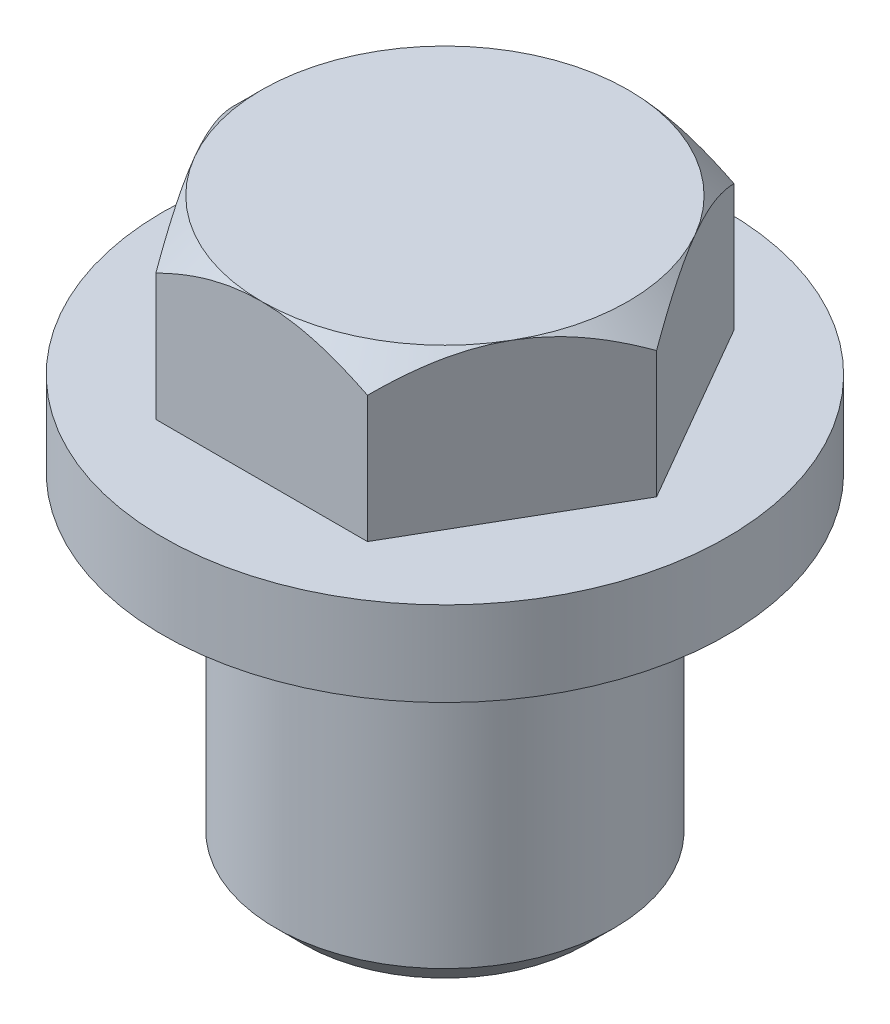
ISO-10303-21;
HEADER;
FILE_DESCRIPTION(('STEP AP214'),'2;1');
FILE_NAME('part.step','',(''),(''),'','','');
FILE_SCHEMA(('AUTOMOTIVE_DESIGN { 1 0 10303 214 1 1 1 1 }'));
ENDSEC;
DATA;
#1=APPLICATION_CONTEXT('core data for automotive mechanical design processes');
#2=APPLICATION_PROTOCOL_DEFINITION('international standard','automotive_design',2000,#1);
#3=PRODUCT_CONTEXT('',#1,'mechanical');
#4=PRODUCT('Part','Part','',(#3));
#5=PRODUCT_RELATED_PRODUCT_CATEGORY('part','',(#4));
#6=PRODUCT_DEFINITION_FORMATION('','',#4);
#7=PRODUCT_DEFINITION_CONTEXT('part definition',#1,'design');
#8=PRODUCT_DEFINITION('design','',#6,#7);
#9=PRODUCT_DEFINITION_SHAPE('','',#8);
#10=(LENGTH_UNIT() NAMED_UNIT(*) SI_UNIT(.MILLI.,.METRE.));
#11=(NAMED_UNIT(*) PLANE_ANGLE_UNIT() SI_UNIT($,.RADIAN.));
#12=(NAMED_UNIT(*) SI_UNIT($,.STERADIAN.) SOLID_ANGLE_UNIT());
#13=UNCERTAINTY_MEASURE_WITH_UNIT(LENGTH_MEASURE(1.E-05),#10,'distance_accuracy_value','');
#14=(GEOMETRIC_REPRESENTATION_CONTEXT(3) GLOBAL_UNCERTAINTY_ASSIGNED_CONTEXT((#13)) GLOBAL_UNIT_ASSIGNED_CONTEXT((#10,
#11,#12)) REPRESENTATION_CONTEXT('',''));
#15=CARTESIAN_POINT('',(0.,0.,0.));
#16=DIRECTION('',(0.,0.,1.));
#17=DIRECTION('',(1.,0.,0.));
#18=AXIS2_PLACEMENT_3D('',#15,#16,#17);
#19=CARTESIAN_POINT('',(3.75277674973257,20.5,-6.5));
#20=DIRECTION('',(0.,0.,1.));
#21=DIRECTION('',(1.,0.,0.));
#22=AXIS2_PLACEMENT_3D('',#19,#20,#21);
#23=PLANE('',#22);
#24=CARTESIAN_POINT('',(13.0579933178711,12.4136642884662,-6.5));
#25=CARTESIAN_POINT('',(12.8676478667876,12.5840618464185,-6.5));
#26=CARTESIAN_POINT('',(12.6769387361621,12.7540531278729,-6.5));
#27=CARTESIAN_POINT('',(12.294693048205,13.0931069803304,-6.5));
#28=CARTESIAN_POINT('',(12.1031564816364,13.2621695409177,-6.5));
#29=CARTESIAN_POINT('',(11.5270349767058,13.7678956282045,-6.5));
#30=CARTESIAN_POINT('',(11.1410639604891,14.1029847366094,-6.5));
#31=CARTESIAN_POINT('',(10.3600902933382,14.7713385939418,-6.5));
#32=CARTESIAN_POINT('',(9.96503495350513,15.1045419396543,-6.5));
#33=CARTESIAN_POINT('',(9.16866881116364,15.7632592959962,-6.5));
#34=CARTESIAN_POINT('',(8.7673591928568,16.0887747336064,-6.5));
#35=CARTESIAN_POINT('',(7.98479662049519,16.7066397978193,-6.5));
#36=CARTESIAN_POINT('',(7.60411840138144,16.9997117654242,-6.5));
#37=CARTESIAN_POINT('',(7.02566999292735,17.429549771014,-6.5));
#38=CARTESIAN_POINT('',(6.83155942765734,17.5712394475604,-6.5));
#39=CARTESIAN_POINT('',(6.44048143614298,17.8506263971717,-6.5));
#40=CARTESIAN_POINT('',(6.24351404813838,17.9883237236021,-6.5));
#41=CARTESIAN_POINT('',(5.84671937761408,18.258542914534,-6.5));
#42=CARTESIAN_POINT('',(5.64689979552351,18.3910760513554,-6.5));
#43=CARTESIAN_POINT('',(5.24340072137308,18.6501903477576,-6.5));
#44=CARTESIAN_POINT('',(5.03972094283108,18.7767710631369,-6.5));
#45=CARTESIAN_POINT('',(4.62810130284319,19.0224021998703,-6.5));
#46=CARTESIAN_POINT('',(4.42016553239671,19.1414594409,-6.5));
#47=CARTESIAN_POINT('',(3.99925370912746,19.3702669186559,-6.5));
#48=CARTESIAN_POINT('',(3.78627875004098,19.4800191517216,-6.5));
#49=CARTESIAN_POINT('',(3.36967244546428,19.6805919761908,-6.5));
#50=CARTESIAN_POINT('',(3.16642228969666,19.7721985201492,-6.5));
#51=CARTESIAN_POINT('',(2.75466543476402,19.9428695641421,-6.5));
#52=CARTESIAN_POINT('',(2.54615870469405,20.021933990418,-6.5));
#53=CARTESIAN_POINT('',(2.12479683004322,20.1643834967131,-6.5));
#54=CARTESIAN_POINT('',(1.9119645011036,20.2278351752403,-6.5));
#55=CARTESIAN_POINT('',(1.48171265610126,20.336501662942,-6.5));
#56=CARTESIAN_POINT('',(1.26429505170368,20.3817239200107,-6.5));
#57=CARTESIAN_POINT('',(0.822334836726203,20.4518789704477,-6.5));
#58=CARTESIAN_POINT('',(0.597733953232176,20.4764523387116,-6.5));
#59=CARTESIAN_POINT('',(0.14719969963484,20.5022218402525,-6.5));
#60=CARTESIAN_POINT('',(-0.0787334743936866,20.5034213316368,-6.5));
#61=CARTESIAN_POINT('',(-0.529843655003775,20.4823416206549,-6.5));
#62=CARTESIAN_POINT('',(-0.755018868705866,20.4600247759557,-6.5));
#63=CARTESIAN_POINT('',(-1.20209837429994,20.3934810962455,-6.5));
#64=CARTESIAN_POINT('',(-1.42400168551428,20.3492478244356,-6.5));
#65=CARTESIAN_POINT('',(-1.91821447954304,20.2281019470089,-6.5));
#66=CARTESIAN_POINT('',(-2.18918356387655,20.1457714741221,-6.5));
#67=CARTESIAN_POINT('',(-2.72262103439964,19.9572567613044,-6.5));
#68=CARTESIAN_POINT('',(-2.98508521594335,19.8510609226492,-6.5));
#69=CARTESIAN_POINT('',(-3.50474538482197,19.6190425400518,-6.5));
#70=CARTESIAN_POINT('',(-3.76184496840596,19.4930066530396,-6.5));
#71=CARTESIAN_POINT('',(-4.14177246811261,19.2933328668315,-6.5));
#72=CARTESIAN_POINT('',(-4.26744936641737,19.2250121128777,-6.5));
#73=CARTESIAN_POINT('',(-4.51706186165945,19.0852575670984,-6.5));
#74=CARTESIAN_POINT('',(-4.64099747502046,19.0138238046608,-6.5));
#75=CARTESIAN_POINT('',(-4.96095487323614,18.8246806872913,-6.5));
#76=CARTESIAN_POINT('',(-5.15572892675147,18.7048617303674,-6.5));
#77=CARTESIAN_POINT('',(-5.54171578730951,18.4596007548328,-6.5));
#78=CARTESIAN_POINT('',(-5.73292818023867,18.3341580880602,-6.5));
#79=CARTESIAN_POINT('',(-6.11232862707531,18.078627555365,-6.5));
#80=CARTESIAN_POINT('',(-6.30051541961305,17.9485378213551,-6.5));
#81=CARTESIAN_POINT('',(-6.67420504220551,17.684552502132,-6.5));
#82=CARTESIAN_POINT('',(-6.85970774778673,17.5506567412638,-6.5));
#83=CARTESIAN_POINT('',(-7.4136436126358,17.1435794055568,-6.5));
#84=CARTESIAN_POINT('',(-7.77858010243288,16.8656395741159,-6.5));
#85=CARTESIAN_POINT('',(-8.50131056399441,16.3008575994114,-6.5));
#86=CARTESIAN_POINT('',(-8.85910610936269,16.0140174538533,-6.5));
#87=CARTESIAN_POINT('',(-9.54248723672809,15.4555943786326,-6.5));
#88=CARTESIAN_POINT('',(-9.86846685398065,15.1844923934395,-6.5));
#89=CARTESIAN_POINT('',(-10.5167496028818,14.637892960225,-6.5));
#90=CARTESIAN_POINT('',(-10.8390524832036,14.3623952147785,-6.5));
#91=CARTESIAN_POINT('',(-11.4788440771141,13.8095482031692,-6.5));
#92=CARTESIAN_POINT('',(-11.7963497890914,13.532218570862,-6.5));
#93=CARTESIAN_POINT('',(-12.4288878968457,12.9748343192829,-6.5));
#94=CARTESIAN_POINT('',(-12.7439206114731,12.6947800620886,-6.5));
#95=CARTESIAN_POINT('',(-13.0579933178711,12.4136642884662,-6.5));
#96=B_SPLINE_CURVE_WITH_KNOTS('',3,(#24,#25,#26,#27,#28,#29,#30,#31,#32,#33,#34,#35,#36,#37,#38,
#39,#40,#41,#42,#43,#44,#45,#46,#47,#48,#49,#50,#51,#52,#53,#54,#55,#56,#57,#58,#59,#60,#61,#62,
#63,#64,#65,#66,#67,#68,#69,#70,#71,#72,#73,#74,#75,#76,#77,#78,#79,#80,#81,#82,#83,#84,#85,#86,
#87,#88,#89,#90,#91,#92,#93,#94,#95),.UNSPECIFIED.,.F.,.F.,(4,2,2,2,2,2,2,2,2,2,2,2,2,2,2,2,2,2,
2,2,2,2,2,2,2,2,2,2,2,2,2,2,2,2,2,4),(0.,0.766419534611869,1.53284764733988,3.06621063208658,
4.61657183546322,6.16664297229325,7.60768402827945,8.32861220564402,9.04953074198019,
9.76877573175528,10.4880743105206,11.2067112387935,11.925193595157,12.593675934138,
13.2621622042391,13.9277454884945,14.5930565627731,15.2697216593766,15.9462895392979,
16.6239420412191,17.301793686039,18.149921778442,18.9984629615211,19.8568453930995,
20.2859530738716,20.7150567046053,21.4009636063593,22.0869497667359,22.7732148623685,
23.4595116819316,24.8354623796852,26.2111064434346,27.4829971557616,28.7549742945708,
30.0196682745985,31.2841964237747),.UNSPECIFIED.);
#97=CARTESIAN_POINT('',(3.75277674973257,19.4944465005349,-6.5));
#98=VERTEX_POINT('',#97);
#99=CARTESIAN_POINT('',(0.,20.5,-6.5));
#100=VERTEX_POINT('',#99);
#101=EDGE_CURVE('E273',#98,#100,#96,.T.);
#102=ORIENTED_EDGE('',*,*,#101,.F.);
#103=DIRECTION('',(0.,-1.,0.));
#104=VECTOR('',#103,1.);
#105=CARTESIAN_POINT('',(3.75277674973257,20.5,-6.5));
#106=LINE('',#105,#104);
#107=CARTESIAN_POINT('',(3.75277674973257,15.,-6.5));
#108=VERTEX_POINT('',#107);
#109=EDGE_CURVE('E256',#98,#108,#106,.T.);
#110=ORIENTED_EDGE('',*,*,#109,.T.);
#111=DIRECTION('',(-1.,0.,0.));
#112=VECTOR('',#111,1.);
#113=CARTESIAN_POINT('',(3.75277674973257,15.,-6.5));
#114=LINE('',#113,#112);
#115=CARTESIAN_POINT('',(-3.75277674973257,15.,-6.5));
#116=VERTEX_POINT('',#115);
#117=EDGE_CURVE('E271',#108,#116,#114,.T.);
#118=ORIENTED_EDGE('',*,*,#117,.T.);
#119=DIRECTION('',(0.,-1.,0.));
#120=VECTOR('',#119,1.);
#121=CARTESIAN_POINT('',(-3.75277674973257,20.5,-6.5));
#122=LINE('',#121,#120);
#123=CARTESIAN_POINT('',(-3.75277674973257,19.4944465005349,-6.5));
#124=VERTEX_POINT('',#123);
#125=EDGE_CURVE('E247',#124,#116,#122,.T.);
#126=ORIENTED_EDGE('',*,*,#125,.F.);
#127=EDGE_CURVE('E179',#100,#124,#96,.T.);
#128=ORIENTED_EDGE('',*,*,#127,.F.);
#129=EDGE_LOOP('',(#102,#110,#118,#126,#128));
#130=FACE_BOUND('',#129,.T.);
#131=ADVANCED_FACE('F38',(#130),#23,.F.);
#132=CARTESIAN_POINT('',(-3.75277674973257,20.5,-6.5));
#133=DIRECTION('',(0.866025403784439,0.,0.5));
#134=DIRECTION('',(0.5,0.,-0.866025403784439));
#135=AXIS2_PLACEMENT_3D('',#132,#133,#134);
#136=PLANE('',#135);
#137=CARTESIAN_POINT('',(-3.75266127967873,19.4943310278164,-6.5002));
#138=CARTESIAN_POINT('',(-3.81718755645788,19.5588505971256,-6.38843721019527));
#139=CARTESIAN_POINT('',(-3.88220981195734,19.6213901510945,-6.27581536004748));
#140=CARTESIAN_POINT('',(-4.0133435827194,19.7419069190787,-6.0486850064995));
#141=CARTESIAN_POINT('',(-4.0794556693862,19.7998816413584,-5.9341755133982));
#142=CARTESIAN_POINT('',(-4.28018681300944,19.9665494716349,-5.58649897398135));
#143=CARTESIAN_POINT('',(-4.41650514865447,20.0672752428145,-5.35038869064092));
#144=CARTESIAN_POINT('',(-4.69140196688396,20.2397611517808,-4.87425343462842));
#145=CARTESIAN_POINT('',(-4.82991018943444,20.3119558356256,-4.63435015590494));
#146=CARTESIAN_POINT('',(-5.0399496233385,20.3954673235371,-4.27055118479009));
#147=CARTESIAN_POINT('',(-5.11027200006593,20.419163228593,-4.14874925538919));
#148=CARTESIAN_POINT('',(-5.25151217356569,20.4577586469965,-3.90411409881775));
#149=CARTESIAN_POINT('',(-5.3224298797485,20.4726594749108,-3.78128102855289));
#150=CARTESIAN_POINT('',(-5.49524688598533,20.4976428826817,-3.48195319333875));
#151=CARTESIAN_POINT('',(-5.59733238973658,20.5028848373424,-3.30513591412532));
#152=CARTESIAN_POINT('',(-5.80131940012282,20.4940862649858,-2.95182004805227));
#153=CARTESIAN_POINT('',(-5.90322082972474,20.4800389787509,-2.77532159461784));
#154=CARTESIAN_POINT('',(-6.10606297517406,20.4334899588109,-2.42398869278334));
#155=CARTESIAN_POINT('',(-6.20700248809816,20.4009675877114,-2.24915632790756));
#156=CARTESIAN_POINT('',(-6.40714660889902,20.3192365179224,-1.90249654184425));
#157=CARTESIAN_POINT('',(-6.50635134919487,20.2700290987382,-1.73066889130016));
#158=CARTESIAN_POINT('',(-6.68245686028528,20.168794739105,-1.42564519859869));
#159=CARTESIAN_POINT('',(-6.7597475954527,20.119430314376,-1.29177371833437));
#160=CARTESIAN_POINT('',(-6.91294161848703,20.0127466105512,-1.02643388702304));
#161=CARTESIAN_POINT('',(-6.98884486421244,19.9554270902921,-0.89496560896725));
#162=CARTESIAN_POINT('',(-7.13902483818045,19.8341180729928,-0.63484626377528));
#163=CARTESIAN_POINT('',(-7.21330583760992,19.7701495516337,-0.506187798726436));
#164=CARTESIAN_POINT('',(-7.36049237141899,19.6363823521427,-0.251253243979178));
#165=CARTESIAN_POINT('',(-7.43339871615508,19.5665872494398,-0.124975750702145));
#166=CARTESIAN_POINT('',(-7.50566896951897,19.4943310278164,0.000199999999997961));
#167=B_SPLINE_CURVE_WITH_KNOTS('',3,(#137,#138,#139,#140,#141,#142,#143,#144,#145,#146,#147,
#148,#149,#150,#151,#152,#153,#154,#155,#156,#157,#158,#159,#160,#161,#162,#163,#164,#165,#166),
.UNSPECIFIED.,.F.,.F.,(4,2,2,2,2,2,2,2,2,2,2,2,2,2,4),(0.,0.432821098198452,0.865876839223425,
1.73666364694241,2.59362329760357,3.02126269407585,3.44883815671482,4.06060100939777,
4.67257828698748,5.28524051521266,5.89785577160171,6.38444407043269,6.87104712368551,
7.35615917312025,7.84097569580793),.UNSPECIFIED.);
#168=CARTESIAN_POINT('',(-5.62916512459885,20.5,-3.25));
#169=VERTEX_POINT('',#168);
#170=EDGE_CURVE('E177',#124,#169,#167,.T.);
#171=ORIENTED_EDGE('',*,*,#170,.F.);
#172=ORIENTED_EDGE('',*,*,#125,.T.);
#173=DIRECTION('',(-0.5,0.,0.866025403784439));
#174=VECTOR('',#173,1.);
#175=CARTESIAN_POINT('',(-3.75277674973257,15.,-6.5));
#176=LINE('',#175,#174);
#177=CARTESIAN_POINT('',(-7.50555349946513,15.,0.));
#178=VERTEX_POINT('',#177);
#179=EDGE_CURVE('E269',#116,#178,#176,.T.);
#180=ORIENTED_EDGE('',*,*,#179,.T.);
#181=DIRECTION('',(0.,-1.,0.));
#182=VECTOR('',#181,1.);
#183=CARTESIAN_POINT('',(-7.50555349946513,20.5,0.));
#184=LINE('',#183,#182);
#185=CARTESIAN_POINT('',(-7.50555349946513,19.4944465005349,0.));
#186=VERTEX_POINT('',#185);
#187=EDGE_CURVE('E249',#186,#178,#184,.T.);
#188=ORIENTED_EDGE('',*,*,#187,.F.);
#189=EDGE_CURVE('E171',#169,#186,#167,.T.);
#190=ORIENTED_EDGE('',*,*,#189,.F.);
#191=EDGE_LOOP('',(#171,#172,#180,#188,#190));
#192=FACE_BOUND('',#191,.T.);
#193=ADVANCED_FACE('F186',(#192),#136,.F.);
#194=CARTESIAN_POINT('',(-7.50555349946513,20.5,0.));
#195=DIRECTION('',(0.866025403784439,0.,-0.5));
#196=DIRECTION('',(-0.5,0.,-0.866025403784439));
#197=AXIS2_PLACEMENT_3D('',#194,#195,#196);
#198=PLANE('',#197);
#199=CARTESIAN_POINT('',(-7.50566896951897,19.4943310278164,-0.000200000000001231));
#200=CARTESIAN_POINT('',(-7.44114269273983,19.5588505971256,0.111562789804731));
#201=CARTESIAN_POINT('',(-7.37612043724037,19.6213901510945,0.224184639952521));
#202=CARTESIAN_POINT('',(-7.24498666647831,19.7419069190787,0.451314993500498));
#203=CARTESIAN_POINT('',(-7.1788745798115,19.7998816413584,0.565824486601802));
#204=CARTESIAN_POINT('',(-6.97814343618827,19.9665494716349,0.913501026018651));
#205=CARTESIAN_POINT('',(-6.84182510054323,20.0672752428145,1.14961130935908));
#206=CARTESIAN_POINT('',(-6.56692828231374,20.2397611517808,1.62574656537158));
#207=CARTESIAN_POINT('',(-6.42842005976327,20.3119558356256,1.86564984409506));
#208=CARTESIAN_POINT('',(-6.2183806258592,20.3954673235371,2.22944881520991));
#209=CARTESIAN_POINT('',(-6.14805824913177,20.419163228593,2.35125074461081));
#210=CARTESIAN_POINT('',(-6.00681807563201,20.4577586469965,2.59588590118225));
#211=CARTESIAN_POINT('',(-5.9359003694492,20.4726594749108,2.71871897144711));
#212=CARTESIAN_POINT('',(-5.76308336321237,20.4976428826817,3.01804680666125));
#213=CARTESIAN_POINT('',(-5.66099785946112,20.5028848373424,3.19486408587468));
#214=CARTESIAN_POINT('',(-5.45701084907488,20.4940862649858,3.54817995194773));
#215=CARTESIAN_POINT('',(-5.35510941947296,20.4800389787509,3.72467840538216));
#216=CARTESIAN_POINT('',(-5.15226727402364,20.4334899588109,4.07601130721665));
#217=CARTESIAN_POINT('',(-5.05132776109955,20.4009675877114,4.25084367209244));
#218=CARTESIAN_POINT('',(-4.85118364029868,20.3192365179224,4.59750345815575));
#219=CARTESIAN_POINT('',(-4.75197890000283,20.2700290987382,4.76933110869983));
#220=CARTESIAN_POINT('',(-4.57587338891242,20.168794739105,5.0743548014013));
#221=CARTESIAN_POINT('',(-4.498582653745,20.119430314376,5.20822628166563));
#222=CARTESIAN_POINT('',(-4.34538863071067,20.0127466105512,5.47356611297696));
#223=CARTESIAN_POINT('',(-4.26948538498527,19.9554270902921,5.60503439103275));
#224=CARTESIAN_POINT('',(-4.11930541101726,19.8341180729928,5.86515373622472));
#225=CARTESIAN_POINT('',(-4.04502441158778,19.7701495516337,5.99381220127356));
#226=CARTESIAN_POINT('',(-3.89783787777871,19.6363823521427,6.24874675602082));
#227=CARTESIAN_POINT('',(-3.82493153304263,19.5665872494398,6.37502424929786));
#228=CARTESIAN_POINT('',(-3.75266127967873,19.4943310278164,6.5002));
#229=B_SPLINE_CURVE_WITH_KNOTS('',3,(#199,#200,#201,#202,#203,#204,#205,#206,#207,#208,#209,
#210,#211,#212,#213,#214,#215,#216,#217,#218,#219,#220,#221,#222,#223,#224,#225,#226,#227,#228),
.UNSPECIFIED.,.F.,.F.,(4,2,2,2,2,2,2,2,2,2,2,2,2,2,4),(0.,0.432821098198451,0.865876839223428,
1.73666364694241,2.59362329760357,3.02126269407586,3.44883815671483,4.06060100939777,
4.67257828698748,5.28524051521266,5.89785577160171,6.3844440704327,6.87104712368551,
7.35615917312025,7.84097569580794),.UNSPECIFIED.);
#230=CARTESIAN_POINT('',(-5.62916512459885,20.5,3.25));
#231=VERTEX_POINT('',#230);
#232=EDGE_CURVE('E178',#186,#231,#229,.T.);
#233=ORIENTED_EDGE('',*,*,#232,.F.);
#234=ORIENTED_EDGE('',*,*,#187,.T.);
#235=DIRECTION('',(0.5,0.,0.866025403784439));
#236=VECTOR('',#235,1.);
#237=CARTESIAN_POINT('',(-7.50555349946513,15.,0.));
#238=LINE('',#237,#236);
#239=CARTESIAN_POINT('',(-3.75277674973257,15.,6.5));
#240=VERTEX_POINT('',#239);
#241=EDGE_CURVE('E266',#178,#240,#238,.T.);
#242=ORIENTED_EDGE('',*,*,#241,.T.);
#243=DIRECTION('',(0.,-1.,0.));
#244=VECTOR('',#243,1.);
#245=CARTESIAN_POINT('',(-3.75277674973257,20.5,6.5));
#246=LINE('',#245,#244);
#247=CARTESIAN_POINT('',(-3.75277674973257,19.4944465005349,6.5));
#248=VERTEX_POINT('',#247);
#249=EDGE_CURVE('E251',#248,#240,#246,.T.);
#250=ORIENTED_EDGE('',*,*,#249,.F.);
#251=EDGE_CURVE('E164',#231,#248,#229,.T.);
#252=ORIENTED_EDGE('',*,*,#251,.F.);
#253=EDGE_LOOP('',(#233,#234,#242,#250,#252));
#254=FACE_BOUND('',#253,.T.);
#255=ADVANCED_FACE('F189',(#254),#198,.F.);
#256=CARTESIAN_POINT('',(-3.75277674973257,20.5,6.5));
#257=DIRECTION('',(0.,0.,-1.));
#258=DIRECTION('',(-1.,0.,0.));
#259=AXIS2_PLACEMENT_3D('',#256,#257,#258);
#260=PLANE('',#259);
#261=CARTESIAN_POINT('',(-13.0579933178711,12.4136642884662,6.5));
#262=CARTESIAN_POINT('',(-12.8676478667876,12.5840618464185,6.5));
#263=CARTESIAN_POINT('',(-12.6769387361621,12.7540531278729,6.5));
#264=CARTESIAN_POINT('',(-12.294693048205,13.0931069803304,6.5));
#265=CARTESIAN_POINT('',(-12.1031564816364,13.2621695409177,6.5));
#266=CARTESIAN_POINT('',(-11.5270349767058,13.7678956282045,6.5));
#267=CARTESIAN_POINT('',(-11.1410639604891,14.1029847366094,6.5));
#268=CARTESIAN_POINT('',(-10.3600902933382,14.7713385939419,6.5));
#269=CARTESIAN_POINT('',(-9.96503495350512,15.1045419396543,6.5));
#270=CARTESIAN_POINT('',(-9.16866881116363,15.7632592959962,6.5));
#271=CARTESIAN_POINT('',(-8.7673591928568,16.0887747336064,6.5));
#272=CARTESIAN_POINT('',(-7.98479662049518,16.7066397978193,6.5));
#273=CARTESIAN_POINT('',(-7.60411840138143,16.9997117654242,6.5));
#274=CARTESIAN_POINT('',(-7.02566999292734,17.429549771014,6.5));
#275=CARTESIAN_POINT('',(-6.83155942765734,17.5712394475604,6.5));
#276=CARTESIAN_POINT('',(-6.44048143614298,17.8506263971717,6.5));
#277=CARTESIAN_POINT('',(-6.24351404813837,17.9883237236021,6.5));
#278=CARTESIAN_POINT('',(-5.84671937761408,18.258542914534,6.5));
#279=CARTESIAN_POINT('',(-5.64689979552351,18.3910760513554,6.5));
#280=CARTESIAN_POINT('',(-5.24340072137308,18.6501903477576,6.5));
#281=CARTESIAN_POINT('',(-5.03972094283108,18.7767710631369,6.5));
#282=CARTESIAN_POINT('',(-4.62810130284319,19.0224021998703,6.5));
#283=CARTESIAN_POINT('',(-4.42016553239671,19.1414594409,6.5));
#284=CARTESIAN_POINT('',(-3.99925370912746,19.3702669186559,6.5));
#285=CARTESIAN_POINT('',(-3.78627875004098,19.4800191517216,6.5));
#286=CARTESIAN_POINT('',(-3.36967244546428,19.6805919761908,6.5));
#287=CARTESIAN_POINT('',(-3.16642228969666,19.7721985201492,6.5));
#288=CARTESIAN_POINT('',(-2.75466543476402,19.9428695641421,6.5));
#289=CARTESIAN_POINT('',(-2.54615870469405,20.021933990418,6.5));
#290=CARTESIAN_POINT('',(-2.12479683004322,20.1643834967131,6.5));
#291=CARTESIAN_POINT('',(-1.9119645011036,20.2278351752403,6.5));
#292=CARTESIAN_POINT('',(-1.48171265610126,20.336501662942,6.5));
#293=CARTESIAN_POINT('',(-1.26429505170368,20.3817239200107,6.5));
#294=CARTESIAN_POINT('',(-0.822334836726206,20.4518789704477,6.5));
#295=CARTESIAN_POINT('',(-0.597733953232178,20.4764523387116,6.5));
#296=CARTESIAN_POINT('',(-0.147199699634842,20.5022218402525,6.5));
#297=CARTESIAN_POINT('',(0.0787334743936834,20.5034213316368,6.5));
#298=CARTESIAN_POINT('',(0.529843655003772,20.4823416206549,6.5));
#299=CARTESIAN_POINT('',(0.755018868705863,20.4600247759557,6.5));
#300=CARTESIAN_POINT('',(1.20209837429994,20.3934810962456,6.5));
#301=CARTESIAN_POINT('',(1.42400168551428,20.3492478244356,6.5));
#302=CARTESIAN_POINT('',(1.91821447954304,20.2281019470089,6.5));
#303=CARTESIAN_POINT('',(2.18918356387654,20.1457714741221,6.5));
#304=CARTESIAN_POINT('',(2.72262103439964,19.9572567613044,6.5));
#305=CARTESIAN_POINT('',(2.98508521594335,19.8510609226492,6.5));
#306=CARTESIAN_POINT('',(3.50474538482197,19.6190425400518,6.5));
#307=CARTESIAN_POINT('',(3.76184496840596,19.4930066530396,6.5));
#308=CARTESIAN_POINT('',(4.1417724681126,19.2933328668315,6.5));
#309=CARTESIAN_POINT('',(4.26744936641736,19.2250121128777,6.5));
#310=CARTESIAN_POINT('',(4.51706186165944,19.0852575670984,6.5));
#311=CARTESIAN_POINT('',(4.64099747502045,19.0138238046608,6.5));
#312=CARTESIAN_POINT('',(4.96095487323613,18.8246806872913,6.5));
#313=CARTESIAN_POINT('',(5.15572892675146,18.7048617303674,6.5));
#314=CARTESIAN_POINT('',(5.5417157873095,18.4596007548328,6.5));
#315=CARTESIAN_POINT('',(5.73292818023866,18.3341580880602,6.5));
#316=CARTESIAN_POINT('',(6.1123286270753,18.078627555365,6.5));
#317=CARTESIAN_POINT('',(6.30051541961304,17.9485378213552,6.5));
#318=CARTESIAN_POINT('',(6.6742050422055,17.684552502132,6.5));
#319=CARTESIAN_POINT('',(6.85970774778672,17.5506567412638,6.5));
#320=CARTESIAN_POINT('',(7.41364361263579,17.1435794055568,6.5));
#321=CARTESIAN_POINT('',(7.77858010243287,16.865639574116,6.5));
#322=CARTESIAN_POINT('',(8.5013105639944,16.3008575994114,6.5));
#323=CARTESIAN_POINT('',(8.85910610936268,16.0140174538533,6.5));
#324=CARTESIAN_POINT('',(9.54248723672808,15.4555943786327,6.5));
#325=CARTESIAN_POINT('',(9.86846685398064,15.1844923934395,6.5));
#326=CARTESIAN_POINT('',(10.5167496028818,14.637892960225,6.5));
#327=CARTESIAN_POINT('',(10.8390524832036,14.3623952147785,6.5));
#328=CARTESIAN_POINT('',(11.4788440771141,13.8095482031692,6.5));
#329=CARTESIAN_POINT('',(11.7963497890914,13.532218570862,6.5));
#330=CARTESIAN_POINT('',(12.4288878968457,12.974834319283,6.5));
#331=CARTESIAN_POINT('',(12.7439206114731,12.6947800620886,6.5));
#332=CARTESIAN_POINT('',(13.0579933178711,12.4136642884662,6.5));
#333=B_SPLINE_CURVE_WITH_KNOTS('',3,(#261,#262,#263,#264,#265,#266,#267,#268,#269,#270,#271,
#272,#273,#274,#275,#276,#277,#278,#279,#280,#281,#282,#283,#284,#285,#286,#287,#288,#289,#290,
#291,#292,#293,#294,#295,#296,#297,#298,#299,#300,#301,#302,#303,#304,#305,#306,#307,#308,#309,
#310,#311,#312,#313,#314,#315,#316,#317,#318,#319,#320,#321,#322,#323,#324,#325,#326,#327,#328,
#329,#330,#331,#332),.UNSPECIFIED.,.F.,.F.,(4,2,2,2,2,2,2,2,2,2,2,2,2,2,2,2,2,2,2,2,2,2,2,2,2,2,
2,2,2,2,2,2,2,2,2,4),(0.,0.766419534611871,1.53284764733988,3.06621063208658,4.61657183546322,
6.16664297229325,7.60768402827945,8.32861220564402,9.04953074198019,9.76877573175527,
10.4880743105206,11.2067112387935,11.925193595157,12.593675934138,13.2621622042391,
13.9277454884945,14.5930565627731,15.2697216593766,15.9462895392979,16.6239420412191,
17.3017936860389,18.149921778442,18.9984629615211,19.8568453930994,20.2859530738716,
20.7150567046053,21.4009636063592,22.0869497667359,22.7732148623685,23.4595116819315,
24.8354623796852,26.2111064434346,27.4829971557616,28.7549742945707,30.0196682745985,
31.2841964237747),.UNSPECIFIED.);
#334=CARTESIAN_POINT('',(0.,20.5,6.5));
#335=VERTEX_POINT('',#334);
#336=EDGE_CURVE('E300',#248,#335,#333,.T.);
#337=ORIENTED_EDGE('',*,*,#336,.F.);
#338=ORIENTED_EDGE('',*,*,#249,.T.);
#339=DIRECTION('',(1.,0.,0.));
#340=VECTOR('',#339,1.);
#341=CARTESIAN_POINT('',(-3.75277674973257,15.,6.5));
#342=LINE('',#341,#340);
#343=CARTESIAN_POINT('',(3.75277674973257,15.,6.5));
#344=VERTEX_POINT('',#343);
#345=EDGE_CURVE('E263',#240,#344,#342,.T.);
#346=ORIENTED_EDGE('',*,*,#345,.T.);
#347=DIRECTION('',(0.,-1.,0.));
#348=VECTOR('',#347,1.);
#349=CARTESIAN_POINT('',(3.75277674973257,20.5,6.5));
#350=LINE('',#349,#348);
#351=CARTESIAN_POINT('',(3.75277674973257,19.4944465005349,6.5));
#352=VERTEX_POINT('',#351);
#353=EDGE_CURVE('E253',#352,#344,#350,.T.);
#354=ORIENTED_EDGE('',*,*,#353,.F.);
#355=EDGE_CURVE('E110',#335,#352,#333,.T.);
#356=ORIENTED_EDGE('',*,*,#355,.F.);
#357=EDGE_LOOP('',(#337,#338,#346,#354,#356));
#358=FACE_BOUND('',#357,.T.);
#359=ADVANCED_FACE('F299',(#358),#260,.F.);
#360=CARTESIAN_POINT('',(3.75277674973257,20.5,6.5));
#361=DIRECTION('',(-0.866025403784438,0.,-0.5));
#362=DIRECTION('',(-0.5,0.,0.866025403784439));
#363=AXIS2_PLACEMENT_3D('',#360,#361,#362);
#364=PLANE('',#363);
#365=CARTESIAN_POINT('',(3.75266127967873,19.4943310278164,6.5002));
#366=CARTESIAN_POINT('',(3.81718755645788,19.5588505971256,6.38843721019526));
#367=CARTESIAN_POINT('',(3.88220981195734,19.6213901510945,6.27581536004747));
#368=CARTESIAN_POINT('',(4.01334358271939,19.7419069190787,6.0486850064995));
#369=CARTESIAN_POINT('',(4.0794556693862,19.7998816413584,5.93417551339819));
#370=CARTESIAN_POINT('',(4.28018681300943,19.9665494716349,5.58649897398135));
#371=CARTESIAN_POINT('',(4.41650514865447,20.0672752428145,5.35038869064092));
#372=CARTESIAN_POINT('',(4.69140196688396,20.2397611517808,4.87425343462841));
#373=CARTESIAN_POINT('',(4.82991018943444,20.3119558356256,4.63435015590493));
#374=CARTESIAN_POINT('',(5.0399496233385,20.3954673235371,4.27055118479008));
#375=CARTESIAN_POINT('',(5.11027200006593,20.419163228593,4.14874925538919));
#376=CARTESIAN_POINT('',(5.25151217356569,20.4577586469965,3.90411409881775));
#377=CARTESIAN_POINT('',(5.3224298797485,20.4726594749108,3.78128102855289));
#378=CARTESIAN_POINT('',(5.49524688598533,20.4976428826817,3.48195319333875));
#379=CARTESIAN_POINT('',(5.59733238973658,20.5028848373424,3.30513591412532));
#380=CARTESIAN_POINT('',(5.80131940012282,20.4940862649858,2.95182004805227));
#381=CARTESIAN_POINT('',(5.90322082972474,20.4800389787509,2.77532159461784));
#382=CARTESIAN_POINT('',(6.10606297517406,20.4334899588109,2.42398869278335));
#383=CARTESIAN_POINT('',(6.20700248809815,20.4009675877114,2.24915632790756));
#384=CARTESIAN_POINT('',(6.40714660889902,20.3192365179224,1.90249654184425));
#385=CARTESIAN_POINT('',(6.50635134919487,20.2700290987382,1.73066889130017));
#386=CARTESIAN_POINT('',(6.68245686028528,20.168794739105,1.4256451985987));
#387=CARTESIAN_POINT('',(6.7597475954527,20.119430314376,1.29177371833437));
#388=CARTESIAN_POINT('',(6.91294161848703,20.0127466105512,1.02643388702304));
#389=CARTESIAN_POINT('',(6.98884486421244,19.9554270902921,0.894965608967247));
#390=CARTESIAN_POINT('',(7.13902483818045,19.8341180729928,0.634846263775277));
#391=CARTESIAN_POINT('',(7.21330583760992,19.7701495516337,0.506187798726433));
#392=CARTESIAN_POINT('',(7.36049237141899,19.6363823521427,0.251253243979173));
#393=CARTESIAN_POINT('',(7.43339871615508,19.5665872494398,0.12497575070214));
#394=CARTESIAN_POINT('',(7.50566896951897,19.4943310278164,-0.000200000000003037));
#395=B_SPLINE_CURVE_WITH_KNOTS('',3,(#365,#366,#367,#368,#369,#370,#371,#372,#373,#374,#375,
#376,#377,#378,#379,#380,#381,#382,#383,#384,#385,#386,#387,#388,#389,#390,#391,#392,#393,#394),
.UNSPECIFIED.,.F.,.F.,(4,2,2,2,2,2,2,2,2,2,2,2,2,2,4),(0.,0.432821098198453,0.86587683922343,
1.73666364694241,2.59362329760357,3.02126269407586,3.44883815671483,4.06060100939777,
4.67257828698748,5.28524051521266,5.89785577160171,6.3844440704327,6.87104712368552,
7.35615917312026,7.84097569580794),.UNSPECIFIED.);
#396=CARTESIAN_POINT('',(5.62916512459885,20.5,3.25));
#397=VERTEX_POINT('',#396);
#398=EDGE_CURVE('E107',#352,#397,#395,.T.);
#399=ORIENTED_EDGE('',*,*,#398,.F.);
#400=ORIENTED_EDGE('',*,*,#353,.T.);
#401=DIRECTION('',(0.5,0.,-0.866025403784439));
#402=VECTOR('',#401,1.);
#403=CARTESIAN_POINT('',(3.75277674973257,15.,6.5));
#404=LINE('',#403,#402);
#405=CARTESIAN_POINT('',(7.50555349946514,15.,0.));
#406=VERTEX_POINT('',#405);
#407=EDGE_CURVE('E261',#344,#406,#404,.T.);
#408=ORIENTED_EDGE('',*,*,#407,.T.);
#409=DIRECTION('',(0.,-1.,0.));
#410=VECTOR('',#409,1.);
#411=CARTESIAN_POINT('',(7.50555349946514,20.5,0.));
#412=LINE('',#411,#410);
#413=CARTESIAN_POINT('',(7.50555349946514,19.4944465005349,0.));
#414=VERTEX_POINT('',#413);
#415=EDGE_CURVE('E131',#414,#406,#412,.T.);
#416=ORIENTED_EDGE('',*,*,#415,.F.);
#417=EDGE_CURVE('E114',#397,#414,#395,.T.);
#418=ORIENTED_EDGE('',*,*,#417,.F.);
#419=EDGE_LOOP('',(#399,#400,#408,#416,#418));
#420=FACE_BOUND('',#419,.T.);
#421=ADVANCED_FACE('F129',(#420),#364,.F.);
#422=CARTESIAN_POINT('',(7.50555349946514,20.5,0.));
#423=DIRECTION('',(-0.866025403784439,0.,0.5));
#424=DIRECTION('',(0.5,0.,0.866025403784439));
#425=AXIS2_PLACEMENT_3D('',#422,#423,#424);
#426=PLANE('',#425);
#427=CARTESIAN_POINT('',(7.50566896951897,19.4943310278164,0.000199999999997272));
#428=CARTESIAN_POINT('',(7.44114269273983,19.5588505971256,-0.111562789804737));
#429=CARTESIAN_POINT('',(7.37612043724037,19.6213901510945,-0.224184639952527));
#430=CARTESIAN_POINT('',(7.24498666647831,19.7419069190787,-0.451314993500503));
#431=CARTESIAN_POINT('',(7.1788745798115,19.7998816413584,-0.565824486601806));
#432=CARTESIAN_POINT('',(6.97814343618827,19.9665494716349,-0.913501026018655));
#433=CARTESIAN_POINT('',(6.84182510054323,20.0672752428145,-1.14961130935909));
#434=CARTESIAN_POINT('',(6.56692828231374,20.2397611517808,-1.62574656537159));
#435=CARTESIAN_POINT('',(6.42842005976327,20.3119558356256,-1.86564984409507));
#436=CARTESIAN_POINT('',(6.2183806258592,20.3954673235371,-2.22944881520992));
#437=CARTESIAN_POINT('',(6.14805824913178,20.419163228593,-2.35125074461082));
#438=CARTESIAN_POINT('',(6.00681807563201,20.4577586469965,-2.59588590118225));
#439=CARTESIAN_POINT('',(5.9359003694492,20.4726594749108,-2.71871897144712));
#440=CARTESIAN_POINT('',(5.76308336321237,20.4976428826817,-3.01804680666125));
#441=CARTESIAN_POINT('',(5.66099785946112,20.5028848373424,-3.19486408587469));
#442=CARTESIAN_POINT('',(5.45701084907488,20.4940862649858,-3.54817995194773));
#443=CARTESIAN_POINT('',(5.35510941947296,20.4800389787509,-3.72467840538216));
#444=CARTESIAN_POINT('',(5.15226727402364,20.4334899588109,-4.07601130721666));
#445=CARTESIAN_POINT('',(5.05132776109955,20.4009675877114,-4.25084367209245));
#446=CARTESIAN_POINT('',(4.85118364029868,20.3192365179224,-4.59750345815576));
#447=CARTESIAN_POINT('',(4.75197890000283,20.2700290987382,-4.76933110869984));
#448=CARTESIAN_POINT('',(4.57587338891242,20.168794739105,-5.07435480140131));
#449=CARTESIAN_POINT('',(4.498582653745,20.119430314376,-5.20822628166563));
#450=CARTESIAN_POINT('',(4.34538863071067,20.0127466105512,-5.47356611297696));
#451=CARTESIAN_POINT('',(4.26948538498527,19.9554270902921,-5.60503439103275));
#452=CARTESIAN_POINT('',(4.11930541101726,19.8341180729928,-5.86515373622472));
#453=CARTESIAN_POINT('',(4.04502441158778,19.7701495516337,-5.99381220127357));
#454=CARTESIAN_POINT('',(3.89783787777871,19.6363823521427,-6.24874675602082));
#455=CARTESIAN_POINT('',(3.82493153304263,19.5665872494398,-6.37502424929786));
#456=CARTESIAN_POINT('',(3.75266127967873,19.4943310278164,-6.5002));
#457=B_SPLINE_CURVE_WITH_KNOTS('',3,(#427,#428,#429,#430,#431,#432,#433,#434,#435,#436,#437,
#438,#439,#440,#441,#442,#443,#444,#445,#446,#447,#448,#449,#450,#451,#452,#453,#454,#455,#456),
.UNSPECIFIED.,.F.,.F.,(4,2,2,2,2,2,2,2,2,2,2,2,2,2,4),(0.,0.432821098198452,0.865876839223429,
1.73666364694241,2.59362329760357,3.02126269407586,3.44883815671483,4.06060100939778,
4.67257828698749,5.28524051521267,5.89785577160172,6.3844440704327,6.87104712368552,
7.35615917312025,7.84097569580793),.UNSPECIFIED.);
#458=CARTESIAN_POINT('',(5.62916512459885,20.5,-3.25));
#459=VERTEX_POINT('',#458);
#460=EDGE_CURVE('E120',#414,#459,#457,.T.);
#461=ORIENTED_EDGE('',*,*,#460,.F.);
#462=ORIENTED_EDGE('',*,*,#415,.T.);
#463=DIRECTION('',(-0.5,0.,-0.866025403784439));
#464=VECTOR('',#463,1.);
#465=CARTESIAN_POINT('',(7.50555349946514,15.,0.));
#466=LINE('',#465,#464);
#467=EDGE_CURVE('E258',#406,#108,#466,.T.);
#468=ORIENTED_EDGE('',*,*,#467,.T.);
#469=ORIENTED_EDGE('',*,*,#109,.F.);
#470=EDGE_CURVE('E126',#459,#98,#457,.T.);
#471=ORIENTED_EDGE('',*,*,#470,.F.);
#472=EDGE_LOOP('',(#461,#462,#468,#469,#471));
#473=FACE_BOUND('',#472,.T.);
#474=ADVANCED_FACE('F222',(#473),#426,.F.);
#475=CARTESIAN_POINT('',(-10.,15.,0.));
#476=DIRECTION('',(0.,1.,0.));
#477=DIRECTION('',(-1.,0.,0.));
#478=AXIS2_PLACEMENT_3D('',#475,#476,#477);
#479=PLANE('',#478);
#480=ORIENTED_EDGE('',*,*,#117,.F.);
#481=ORIENTED_EDGE('',*,*,#467,.F.);
#482=ORIENTED_EDGE('',*,*,#407,.F.);
#483=ORIENTED_EDGE('',*,*,#345,.F.);
#484=ORIENTED_EDGE('',*,*,#241,.F.);
#485=ORIENTED_EDGE('',*,*,#179,.F.);
#486=EDGE_LOOP('',(#480,#481,#482,#483,#484,#485));
#487=FACE_BOUND('',#486,.T.);
#488=CARTESIAN_POINT('',(0.,15.,0.));
#489=DIRECTION('',(0.,1.,0.));
#490=DIRECTION('',(-1.,0.,0.));
#491=AXIS2_PLACEMENT_3D('',#488,#489,#490);
#492=CIRCLE('',#491,10.);
#493=CARTESIAN_POINT('',(-10.,15.,0.));
#494=VERTEX_POINT('',#493);
#495=EDGE_CURVE('E230',#494,#494,#492,.T.);
#496=ORIENTED_EDGE('',*,*,#495,.T.);
#497=EDGE_LOOP('',(#496));
#498=FACE_BOUND('',#497,.T.);
#499=ADVANCED_FACE('F40',(#487,#498),#479,.T.);
#500=CARTESIAN_POINT('',(0.,15.,0.));
#501=DIRECTION('',(0.,1.,0.));
#502=DIRECTION('',(-1.,0.,0.));
#503=AXIS2_PLACEMENT_3D('',#500,#501,#502);
#504=CYLINDRICAL_SURFACE('',#503,10.);
#505=CARTESIAN_POINT('',(0.,12.,0.));
#506=DIRECTION('',(0.,1.,0.));
#507=DIRECTION('',(-1.,0.,0.));
#508=AXIS2_PLACEMENT_3D('',#505,#506,#507);
#509=CIRCLE('',#508,10.);
#510=CARTESIAN_POINT('',(-10.,12.,0.));
#511=VERTEX_POINT('',#510);
#512=EDGE_CURVE('E227',#511,#511,#509,.T.);
#513=ORIENTED_EDGE('',*,*,#512,.T.);
#514=EDGE_LOOP('',(#513));
#515=FACE_BOUND('',#514,.T.);
#516=ORIENTED_EDGE('',*,*,#495,.F.);
#517=EDGE_LOOP('',(#516));
#518=FACE_BOUND('',#517,.T.);
#519=ADVANCED_FACE('F215',(#515,#518),#504,.T.);
#520=CARTESIAN_POINT('',(-6.,12.,0.));
#521=DIRECTION('',(0.,-1.,0.));
#522=DIRECTION('',(1.,0.,0.));
#523=AXIS2_PLACEMENT_3D('',#520,#521,#522);
#524=PLANE('',#523);
#525=CARTESIAN_POINT('',(0.,12.,0.));
#526=DIRECTION('',(0.,1.,0.));
#527=DIRECTION('',(-1.,0.,0.));
#528=AXIS2_PLACEMENT_3D('',#525,#526,#527);
#529=CIRCLE('',#528,6.);
#530=CARTESIAN_POINT('',(-6.,12.,0.));
#531=VERTEX_POINT('',#530);
#532=EDGE_CURVE('E233',#531,#531,#529,.T.);
#533=ORIENTED_EDGE('',*,*,#532,.T.);
#534=EDGE_LOOP('',(#533));
#535=FACE_BOUND('',#534,.T.);
#536=ORIENTED_EDGE('',*,*,#512,.F.);
#537=EDGE_LOOP('',(#536));
#538=FACE_BOUND('',#537,.T.);
#539=ADVANCED_FACE('F212',(#535,#538),#524,.T.);
#540=CARTESIAN_POINT('',(0.,11.,0.));
#541=DIRECTION('',(0.,1.,0.));
#542=DIRECTION('',(-1.,0.,0.));
#543=AXIS2_PLACEMENT_3D('',#540,#541,#542);
#544=TOROIDAL_SURFACE('',#543,6.,1.);
#545=CARTESIAN_POINT('',(0.,10.,0.));
#546=DIRECTION('',(0.,1.,0.));
#547=DIRECTION('',(-1.,0.,0.));
#548=AXIS2_PLACEMENT_3D('',#545,#546,#547);
#549=CIRCLE('',#548,6.);
#550=CARTESIAN_POINT('',(-6.,10.,0.));
#551=VERTEX_POINT('',#550);
#552=EDGE_CURVE('E238',#551,#551,#549,.T.);
#553=ORIENTED_EDGE('',*,*,#552,.T.);
#554=EDGE_LOOP('',(#553));
#555=FACE_BOUND('',#554,.T.);
#556=ORIENTED_EDGE('',*,*,#532,.F.);
#557=EDGE_LOOP('',(#556));
#558=FACE_BOUND('',#557,.T.);
#559=ADVANCED_FACE('F208',(#555,#558),#544,.F.);
#560=CARTESIAN_POINT('',(0.,15.,0.));
#561=DIRECTION('',(0.,1.,0.));
#562=DIRECTION('',(-1.,0.,0.));
#563=AXIS2_PLACEMENT_3D('',#560,#561,#562);
#564=CYLINDRICAL_SURFACE('',#563,6.);
#565=CARTESIAN_POINT('',(0.,1.,0.));
#566=DIRECTION('',(0.,1.,0.));
#567=DIRECTION('',(-1.,0.,0.));
#568=AXIS2_PLACEMENT_3D('',#565,#566,#567);
#569=CIRCLE('',#568,6.);
#570=CARTESIAN_POINT('',(-6.,1.,0.));
#571=VERTEX_POINT('',#570);
#572=EDGE_CURVE('E241',#571,#571,#569,.T.);
#573=ORIENTED_EDGE('',*,*,#572,.T.);
#574=EDGE_LOOP('',(#573));
#575=FACE_BOUND('',#574,.T.);
#576=ORIENTED_EDGE('',*,*,#552,.F.);
#577=EDGE_LOOP('',(#576));
#578=FACE_BOUND('',#577,.T.);
#579=ADVANCED_FACE('F204',(#575,#578),#564,.T.);
#580=CARTESIAN_POINT('',(0.,1.,0.));
#581=DIRECTION('',(0.,1.,0.));
#582=DIRECTION('',(-1.,0.,0.));
#583=AXIS2_PLACEMENT_3D('',#580,#581,#582);
#584=CONICAL_SURFACE('',#583,6.,0.785398163397448);
#585=CARTESIAN_POINT('',(0.,0.,0.));
#586=DIRECTION('',(0.,1.,0.));
#587=DIRECTION('',(-1.,0.,0.));
#588=AXIS2_PLACEMENT_3D('',#585,#586,#587);
#589=CIRCLE('',#588,5.);
#590=CARTESIAN_POINT('',(-5.,0.,0.));
#591=VERTEX_POINT('',#590);
#592=EDGE_CURVE('E244',#591,#591,#589,.T.);
#593=ORIENTED_EDGE('',*,*,#592,.T.);
#594=EDGE_LOOP('',(#593));
#595=FACE_BOUND('',#594,.T.);
#596=ORIENTED_EDGE('',*,*,#572,.F.);
#597=EDGE_LOOP('',(#596));
#598=FACE_BOUND('',#597,.T.);
#599=ADVANCED_FACE('F200',(#595,#598),#584,.T.);
#600=CARTESIAN_POINT('',(0.,0.,0.));
#601=DIRECTION('',(0.,-1.,0.));
#602=DIRECTION('',(1.,0.,0.));
#603=AXIS2_PLACEMENT_3D('',#600,#601,#602);
#604=PLANE('',#603);
#605=ORIENTED_EDGE('',*,*,#592,.F.);
#606=EDGE_LOOP('',(#605));
#607=FACE_BOUND('',#606,.T.);
#608=ADVANCED_FACE('F196',(#607),#604,.T.);
#609=CARTESIAN_POINT('',(0.,20.5,0.));
#610=DIRECTION('',(0.,-1.,0.));
#611=DIRECTION('',(0.,0.,1.));
#612=AXIS2_PLACEMENT_3D('',#609,#610,#611);
#613=CONICAL_SURFACE('',#612,6.5,0.78539816339745);
#614=ORIENTED_EDGE('',*,*,#251,.T.);
#615=ORIENTED_EDGE('',*,*,#336,.T.);
#616=CARTESIAN_POINT('',(0.,20.5,0.));
#617=DIRECTION('',(0.,1.,0.));
#618=DIRECTION('',(0.,0.,1.));
#619=AXIS2_PLACEMENT_3D('',#616,#617,#618);
#620=CIRCLE('',#619,6.5);
#621=EDGE_CURVE('E42',#231,#335,#620,.T.);
#622=ORIENTED_EDGE('',*,*,#621,.F.);
#623=EDGE_LOOP('',(#614,#615,#622));
#624=FACE_BOUND('',#623,.T.);
#625=ADVANCED_FACE('F199',(#624),#613,.T.);
#626=ORIENTED_EDGE('',*,*,#189,.T.);
#627=ORIENTED_EDGE('',*,*,#232,.T.);
#628=EDGE_CURVE('E232',#169,#231,#620,.T.);
#629=ORIENTED_EDGE('',*,*,#628,.F.);
#630=EDGE_LOOP('',(#626,#627,#629));
#631=FACE_BOUND('',#630,.T.);
#632=ADVANCED_FACE('F286',(#631),#613,.T.);
#633=ORIENTED_EDGE('',*,*,#127,.T.);
#634=ORIENTED_EDGE('',*,*,#170,.T.);
#635=EDGE_CURVE('E283',#100,#169,#620,.T.);
#636=ORIENTED_EDGE('',*,*,#635,.F.);
#637=EDGE_LOOP('',(#633,#634,#636));
#638=FACE_BOUND('',#637,.T.);
#639=ADVANCED_FACE('F156',(#638),#613,.T.);
#640=ORIENTED_EDGE('',*,*,#101,.T.);
#641=EDGE_CURVE('E47',#459,#100,#620,.T.);
#642=ORIENTED_EDGE('',*,*,#641,.F.);
#643=ORIENTED_EDGE('',*,*,#470,.T.);
#644=EDGE_LOOP('',(#640,#642,#643));
#645=FACE_BOUND('',#644,.T.);
#646=ADVANCED_FACE('F152',(#645),#613,.T.);
#647=ORIENTED_EDGE('',*,*,#417,.T.);
#648=ORIENTED_EDGE('',*,*,#460,.T.);
#649=EDGE_CURVE('E12',#397,#459,#620,.T.);
#650=ORIENTED_EDGE('',*,*,#649,.F.);
#651=EDGE_LOOP('',(#647,#648,#650));
#652=FACE_BOUND('',#651,.T.);
#653=ADVANCED_FACE('F118',(#652),#613,.T.);
#654=ORIENTED_EDGE('',*,*,#355,.T.);
#655=ORIENTED_EDGE('',*,*,#398,.T.);
#656=CARTESIAN_POINT('',(0.,20.5,0.));
#657=DIRECTION('',(0.,1.,0.));
#658=DIRECTION('',(0.,0.,1.));
#659=AXIS2_PLACEMENT_3D('',#656,#657,#658);
#660=CIRCLE('',#659,6.5);
#661=EDGE_CURVE('E54',#335,#397,#660,.T.);
#662=ORIENTED_EDGE('',*,*,#661,.F.);
#663=EDGE_LOOP('',(#654,#655,#662));
#664=FACE_BOUND('',#663,.T.);
#665=ADVANCED_FACE('F108',(#664),#613,.T.);
#666=CARTESIAN_POINT('',(0.,20.5,0.));
#667=DIRECTION('',(0.,1.,0.));
#668=DIRECTION('',(0.,0.,1.));
#669=AXIS2_PLACEMENT_3D('',#666,#667,#668);
#670=PLANE('',#669);
#671=ORIENTED_EDGE('',*,*,#621,.T.);
#672=ORIENTED_EDGE('',*,*,#661,.T.);
#673=ORIENTED_EDGE('',*,*,#649,.T.);
#674=ORIENTED_EDGE('',*,*,#641,.T.);
#675=ORIENTED_EDGE('',*,*,#635,.T.);
#676=ORIENTED_EDGE('',*,*,#628,.T.);
#677=EDGE_LOOP('',(#671,#672,#673,#674,#675,#676));
#678=FACE_BOUND('',#677,.T.);
#679=ADVANCED_FACE('F123',(#678),#670,.T.);
#680=CLOSED_SHELL('',(#131,#193,#255,#359,#421,#474,#499,#519,#539,#559,#579,#599,#608,#625,
#632,#639,#646,#653,#665,#679));
#681=MANIFOLD_SOLID_BREP('B2',#680);
#682=ADVANCED_BREP_SHAPE_REPRESENTATION('',(#18,#681),#14);
#683=SHAPE_DEFINITION_REPRESENTATION(#9,#682);
ENDSEC;
END-ISO-10303-21;
